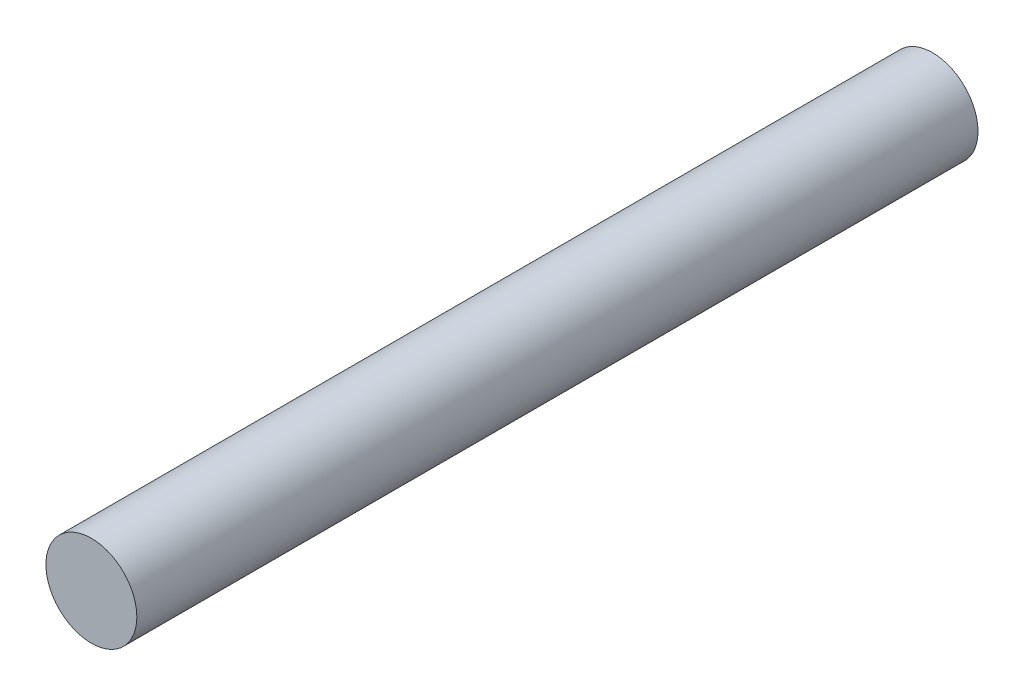
ISO-10303-21;
HEADER;
FILE_DESCRIPTION(('STEP AP214'),'2;1');
FILE_NAME('part.step','',(''),(''),'','','');
FILE_SCHEMA(('AUTOMOTIVE_DESIGN { 1 0 10303 214 1 1 1 1 }'));
ENDSEC;
DATA;
#1=APPLICATION_CONTEXT('core data for automotive mechanical design processes');
#2=APPLICATION_PROTOCOL_DEFINITION('international standard','automotive_design',2000,#1);
#3=PRODUCT_CONTEXT('',#1,'mechanical');
#4=PRODUCT('Part','Part','',(#3));
#5=PRODUCT_RELATED_PRODUCT_CATEGORY('part','',(#4));
#6=PRODUCT_DEFINITION_FORMATION('','',#4);
#7=PRODUCT_DEFINITION_CONTEXT('part definition',#1,'design');
#8=PRODUCT_DEFINITION('design','',#6,#7);
#9=PRODUCT_DEFINITION_SHAPE('','',#8);
#10=(LENGTH_UNIT() NAMED_UNIT(*) SI_UNIT(.MILLI.,.METRE.));
#11=(NAMED_UNIT(*) PLANE_ANGLE_UNIT() SI_UNIT($,.RADIAN.));
#12=(NAMED_UNIT(*) SI_UNIT($,.STERADIAN.) SOLID_ANGLE_UNIT());
#13=UNCERTAINTY_MEASURE_WITH_UNIT(LENGTH_MEASURE(1.E-05),#10,'distance_accuracy_value','');
#14=(GEOMETRIC_REPRESENTATION_CONTEXT(3) GLOBAL_UNCERTAINTY_ASSIGNED_CONTEXT((#13)) GLOBAL_UNIT_ASSIGNED_CONTEXT((#10,
#11,#12)) REPRESENTATION_CONTEXT('',''));
#15=CARTESIAN_POINT('',(0.,0.,0.));
#16=DIRECTION('',(0.,0.,1.));
#17=DIRECTION('',(1.,0.,0.));
#18=AXIS2_PLACEMENT_3D('',#15,#16,#17);
#19=CARTESIAN_POINT('',(0.,0.,74.));
#20=DIRECTION('',(0.,0.,-1.));
#21=DIRECTION('',(-1.,0.,0.));
#22=AXIS2_PLACEMENT_3D('',#19,#20,#21);
#23=CYLINDRICAL_SURFACE('',#22,4.);
#24=CARTESIAN_POINT('',(0.,0.,74.));
#25=DIRECTION('',(0.,0.,1.));
#26=DIRECTION('',(1.,0.,0.));
#27=AXIS2_PLACEMENT_3D('',#24,#25,#26);
#28=CIRCLE('',#27,4.);
#29=CARTESIAN_POINT('',(4.,0.,74.));
#30=VERTEX_POINT('',#29);
#31=EDGE_CURVE('E10',#30,#30,#28,.T.);
#32=ORIENTED_EDGE('',*,*,#31,.F.);
#33=EDGE_LOOP('',(#32));
#34=FACE_BOUND('',#33,.T.);
#35=CARTESIAN_POINT('',(0.,0.,0.));
#36=DIRECTION('',(0.,0.,1.));
#37=DIRECTION('',(1.,0.,0.));
#38=AXIS2_PLACEMENT_3D('',#35,#36,#37);
#39=CIRCLE('',#38,4.);
#40=CARTESIAN_POINT('',(4.,0.,0.));
#41=VERTEX_POINT('',#40);
#42=EDGE_CURVE('E34',#41,#41,#39,.T.);
#43=ORIENTED_EDGE('',*,*,#42,.T.);
#44=EDGE_LOOP('',(#43));
#45=FACE_BOUND('',#44,.T.);
#46=ADVANCED_FACE('F31',(#34,#45),#23,.T.);
#47=CARTESIAN_POINT('',(0.,0.,74.));
#48=DIRECTION('',(0.,0.,1.));
#49=DIRECTION('',(1.,0.,0.));
#50=AXIS2_PLACEMENT_3D('',#47,#48,#49);
#51=PLANE('',#50);
#52=ORIENTED_EDGE('',*,*,#31,.T.);
#53=EDGE_LOOP('',(#52));
#54=FACE_BOUND('',#53,.T.);
#55=ADVANCED_FACE('F46',(#54),#51,.T.);
#56=CARTESIAN_POINT('',(0.,0.,0.));
#57=DIRECTION('',(0.,0.,1.));
#58=DIRECTION('',(1.,0.,0.));
#59=AXIS2_PLACEMENT_3D('',#56,#57,#58);
#60=PLANE('',#59);
#61=ORIENTED_EDGE('',*,*,#42,.F.);
#62=EDGE_LOOP('',(#61));
#63=FACE_BOUND('',#62,.T.);
#64=ADVANCED_FACE('F44',(#63),#60,.F.);
#65=CLOSED_SHELL('',(#46,#55,#64));
#66=MANIFOLD_SOLID_BREP('B2',#65);
#67=ADVANCED_BREP_SHAPE_REPRESENTATION('',(#18,#66),#14);
#68=SHAPE_DEFINITION_REPRESENTATION(#9,#67);
ENDSEC;
END-ISO-10303-21;
